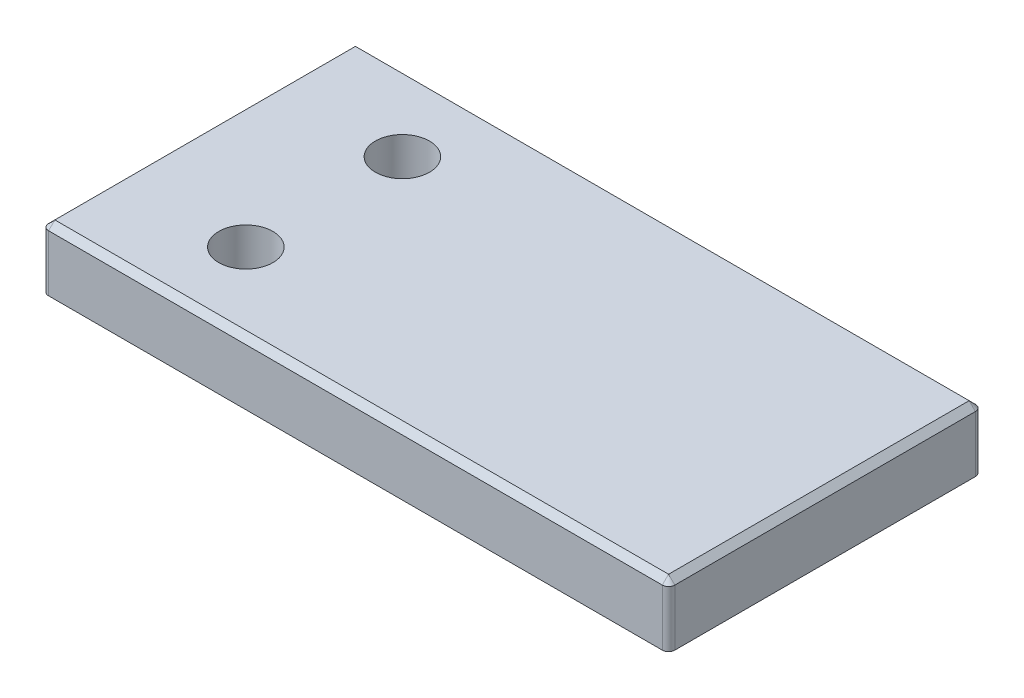
ISO-10303-21;
HEADER;
FILE_DESCRIPTION(('STEP AP214'),'2;1');
FILE_NAME('part.step','',(''),(''),'','','');
FILE_SCHEMA(('AUTOMOTIVE_DESIGN { 1 0 10303 214 1 1 1 1 }'));
ENDSEC;
DATA;
#1=APPLICATION_CONTEXT('core data for automotive mechanical design processes');
#2=APPLICATION_PROTOCOL_DEFINITION('international standard','automotive_design',2000,#1);
#3=PRODUCT_CONTEXT('',#1,'mechanical');
#4=PRODUCT('Part','Part','',(#3));
#5=PRODUCT_RELATED_PRODUCT_CATEGORY('part','',(#4));
#6=PRODUCT_DEFINITION_FORMATION('','',#4);
#7=PRODUCT_DEFINITION_CONTEXT('part definition',#1,'design');
#8=PRODUCT_DEFINITION('design','',#6,#7);
#9=PRODUCT_DEFINITION_SHAPE('','',#8);
#10=(LENGTH_UNIT() NAMED_UNIT(*) SI_UNIT(.MILLI.,.METRE.));
#11=(NAMED_UNIT(*) PLANE_ANGLE_UNIT() SI_UNIT($,.RADIAN.));
#12=(NAMED_UNIT(*) SI_UNIT($,.STERADIAN.) SOLID_ANGLE_UNIT());
#13=UNCERTAINTY_MEASURE_WITH_UNIT(LENGTH_MEASURE(1.E-05),#10,'distance_accuracy_value','');
#14=(GEOMETRIC_REPRESENTATION_CONTEXT(3) GLOBAL_UNCERTAINTY_ASSIGNED_CONTEXT((#13)) GLOBAL_UNIT_ASSIGNED_CONTEXT((#10,
#11,#12)) REPRESENTATION_CONTEXT('',''));
#15=CARTESIAN_POINT('',(0.,0.,0.));
#16=DIRECTION('',(0.,0.,1.));
#17=DIRECTION('',(1.,0.,0.));
#18=AXIS2_PLACEMENT_3D('',#15,#16,#17);
#19=CARTESIAN_POINT('',(-50.,10.,25.));
#20=DIRECTION('',(1.,0.,0.));
#21=DIRECTION('',(0.,0.,-1.));
#22=AXIS2_PLACEMENT_3D('',#19,#20,#21);
#23=PLANE('',#22);
#24=DIRECTION('',(0.,-1.,0.));
#25=VECTOR('',#24,1.);
#26=CARTESIAN_POINT('',(-50.,10.,24.));
#27=LINE('',#26,#25);
#28=CARTESIAN_POINT('',(-50.,0.,24.));
#29=VERTEX_POINT('',#28);
#30=CARTESIAN_POINT('',(-50.,9.00000000000001,24.));
#31=VERTEX_POINT('',#30);
#32=EDGE_CURVE('E125',#29,#31,#27,.F.);
#33=ORIENTED_EDGE('',*,*,#32,.T.);
#34=DIRECTION('',(0.,0.,-1.));
#35=VECTOR('',#34,1.);
#36=CARTESIAN_POINT('',(-50.,9.00000000000001,25.));
#37=LINE('',#36,#35);
#38=CARTESIAN_POINT('',(-50.,9.00000000000001,-24.));
#39=VERTEX_POINT('',#38);
#40=EDGE_CURVE('E42',#31,#39,#37,.T.);
#41=ORIENTED_EDGE('',*,*,#40,.T.);
#42=DIRECTION('',(0.,-1.,0.));
#43=VECTOR('',#42,1.);
#44=CARTESIAN_POINT('',(-50.,10.,-24.));
#45=LINE('',#44,#43);
#46=CARTESIAN_POINT('',(-50.,0.,-24.));
#47=VERTEX_POINT('',#46);
#48=EDGE_CURVE('E129',#39,#47,#45,.T.);
#49=ORIENTED_EDGE('',*,*,#48,.T.);
#50=DIRECTION('',(0.,0.,1.));
#51=VECTOR('',#50,1.);
#52=CARTESIAN_POINT('',(-50.,0.,25.));
#53=LINE('',#52,#51);
#54=EDGE_CURVE('E136',#47,#29,#53,.T.);
#55=ORIENTED_EDGE('',*,*,#54,.T.);
#56=EDGE_LOOP('',(#33,#41,#49,#55));
#57=FACE_BOUND('',#56,.T.);
#58=ADVANCED_FACE('F33',(#57),#23,.F.);
#59=CARTESIAN_POINT('',(50.,10.,25.));
#60=DIRECTION('',(0.,0.,-1.));
#61=DIRECTION('',(-1.,0.,0.));
#62=AXIS2_PLACEMENT_3D('',#59,#60,#61);
#63=PLANE('',#62);
#64=DIRECTION('',(0.,-1.,0.));
#65=VECTOR('',#64,1.);
#66=CARTESIAN_POINT('',(49.,10.,25.));
#67=LINE('',#66,#65);
#68=CARTESIAN_POINT('',(49.,0.,25.));
#69=VERTEX_POINT('',#68);
#70=CARTESIAN_POINT('',(49.,9.00000000000001,25.));
#71=VERTEX_POINT('',#70);
#72=EDGE_CURVE('E121',#69,#71,#67,.F.);
#73=ORIENTED_EDGE('',*,*,#72,.T.);
#74=DIRECTION('',(-1.,0.,0.));
#75=VECTOR('',#74,1.);
#76=CARTESIAN_POINT('',(50.,9.00000000000001,25.));
#77=LINE('',#76,#75);
#78=CARTESIAN_POINT('',(-49.,9.00000000000001,25.));
#79=VERTEX_POINT('',#78);
#80=EDGE_CURVE('E119',#71,#79,#77,.T.);
#81=ORIENTED_EDGE('',*,*,#80,.T.);
#82=DIRECTION('',(0.,-1.,0.));
#83=VECTOR('',#82,1.);
#84=CARTESIAN_POINT('',(-49.,10.,25.));
#85=LINE('',#84,#83);
#86=CARTESIAN_POINT('',(-49.,0.,25.));
#87=VERTEX_POINT('',#86);
#88=EDGE_CURVE('E111',#79,#87,#85,.T.);
#89=ORIENTED_EDGE('',*,*,#88,.T.);
#90=DIRECTION('',(1.,0.,0.));
#91=VECTOR('',#90,1.);
#92=CARTESIAN_POINT('',(50.,0.,25.));
#93=LINE('',#92,#91);
#94=EDGE_CURVE('E116',#87,#69,#93,.T.);
#95=ORIENTED_EDGE('',*,*,#94,.T.);
#96=EDGE_LOOP('',(#73,#81,#89,#95));
#97=FACE_BOUND('',#96,.T.);
#98=ADVANCED_FACE('F114',(#97),#63,.F.);
#99=CARTESIAN_POINT('',(50.,10.,-25.));
#100=DIRECTION('',(-1.,0.,0.));
#101=DIRECTION('',(0.,0.,1.));
#102=AXIS2_PLACEMENT_3D('',#99,#100,#101);
#103=PLANE('',#102);
#104=DIRECTION('',(0.,-1.,0.));
#105=VECTOR('',#104,1.);
#106=CARTESIAN_POINT('',(50.,10.,-24.));
#107=LINE('',#106,#105);
#108=CARTESIAN_POINT('',(50.,0.,-24.));
#109=VERTEX_POINT('',#108);
#110=CARTESIAN_POINT('',(50.,9.00000000000001,-24.));
#111=VERTEX_POINT('',#110);
#112=EDGE_CURVE('E161',#109,#111,#107,.F.);
#113=ORIENTED_EDGE('',*,*,#112,.T.);
#114=DIRECTION('',(0.,0.,1.));
#115=VECTOR('',#114,1.);
#116=CARTESIAN_POINT('',(50.,9.00000000000001,-25.));
#117=LINE('',#116,#115);
#118=CARTESIAN_POINT('',(50.,9.00000000000001,24.));
#119=VERTEX_POINT('',#118);
#120=EDGE_CURVE('E176',#111,#119,#117,.T.);
#121=ORIENTED_EDGE('',*,*,#120,.T.);
#122=DIRECTION('',(0.,-1.,0.));
#123=VECTOR('',#122,1.);
#124=CARTESIAN_POINT('',(50.,10.,24.));
#125=LINE('',#124,#123);
#126=CARTESIAN_POINT('',(50.,0.,24.));
#127=VERTEX_POINT('',#126);
#128=EDGE_CURVE('E159',#119,#127,#125,.T.);
#129=ORIENTED_EDGE('',*,*,#128,.T.);
#130=DIRECTION('',(0.,0.,-1.));
#131=VECTOR('',#130,1.);
#132=CARTESIAN_POINT('',(50.,0.,-25.));
#133=LINE('',#132,#131);
#134=EDGE_CURVE('E135',#127,#109,#133,.T.);
#135=ORIENTED_EDGE('',*,*,#134,.T.);
#136=EDGE_LOOP('',(#113,#121,#129,#135));
#137=FACE_BOUND('',#136,.T.);
#138=ADVANCED_FACE('F262',(#137),#103,.F.);
#139=CARTESIAN_POINT('',(-50.,10.,-25.));
#140=DIRECTION('',(0.,0.,1.));
#141=DIRECTION('',(1.,0.,0.));
#142=AXIS2_PLACEMENT_3D('',#139,#140,#141);
#143=PLANE('',#142);
#144=DIRECTION('',(0.,-1.,0.));
#145=VECTOR('',#144,1.);
#146=CARTESIAN_POINT('',(-49.,10.,-25.));
#147=LINE('',#146,#145);
#148=CARTESIAN_POINT('',(-49.,0.,-25.));
#149=VERTEX_POINT('',#148);
#150=CARTESIAN_POINT('',(-49.,9.00000000000001,-25.));
#151=VERTEX_POINT('',#150);
#152=EDGE_CURVE('E156',#149,#151,#147,.F.);
#153=ORIENTED_EDGE('',*,*,#152,.T.);
#154=DIRECTION('',(1.,0.,0.));
#155=VECTOR('',#154,1.);
#156=CARTESIAN_POINT('',(-50.,9.00000000000001,-25.));
#157=LINE('',#156,#155);
#158=CARTESIAN_POINT('',(49.,9.00000000000001,-25.));
#159=VERTEX_POINT('',#158);
#160=EDGE_CURVE('E180',#151,#159,#157,.T.);
#161=ORIENTED_EDGE('',*,*,#160,.T.);
#162=DIRECTION('',(0.,-1.,0.));
#163=VECTOR('',#162,1.);
#164=CARTESIAN_POINT('',(49.,10.,-25.));
#165=LINE('',#164,#163);
#166=CARTESIAN_POINT('',(49.,0.,-25.));
#167=VERTEX_POINT('',#166);
#168=EDGE_CURVE('E154',#159,#167,#165,.T.);
#169=ORIENTED_EDGE('',*,*,#168,.T.);
#170=DIRECTION('',(-1.,0.,0.));
#171=VECTOR('',#170,1.);
#172=CARTESIAN_POINT('',(-50.,0.,-25.));
#173=LINE('',#172,#171);
#174=EDGE_CURVE('E139',#167,#149,#173,.T.);
#175=ORIENTED_EDGE('',*,*,#174,.T.);
#176=EDGE_LOOP('',(#153,#161,#169,#175));
#177=FACE_BOUND('',#176,.T.);
#178=ADVANCED_FACE('F224',(#177),#143,.F.);
#179=CARTESIAN_POINT('',(0.,10.,0.));
#180=DIRECTION('',(0.,-1.,0.));
#181=DIRECTION('',(0.,0.,-1.));
#182=AXIS2_PLACEMENT_3D('',#179,#180,#181);
#183=PLANE('',#182);
#184=CARTESIAN_POINT('',(-30.,10.,-12.5));
#185=DIRECTION('',(0.,1.,0.));
#186=DIRECTION('',(0.,0.,1.));
#187=AXIS2_PLACEMENT_3D('',#184,#185,#186);
#188=CIRCLE('',#187,4.3235);
#189=CARTESIAN_POINT('',(-30.,10.,-8.1765));
#190=VERTEX_POINT('',#189);
#191=EDGE_CURVE('E214',#190,#190,#188,.T.);
#192=ORIENTED_EDGE('',*,*,#191,.F.);
#193=EDGE_LOOP('',(#192));
#194=FACE_BOUND('',#193,.T.);
#195=CARTESIAN_POINT('',(-30.,10.,12.5));
#196=DIRECTION('',(0.,1.,0.));
#197=DIRECTION('',(0.,0.,1.));
#198=AXIS2_PLACEMENT_3D('',#195,#196,#197);
#199=CIRCLE('',#198,4.3235);
#200=CARTESIAN_POINT('',(-30.,10.,16.8235));
#201=VERTEX_POINT('',#200);
#202=EDGE_CURVE('E207',#201,#201,#199,.T.);
#203=ORIENTED_EDGE('',*,*,#202,.F.);
#204=EDGE_LOOP('',(#203));
#205=FACE_BOUND('',#204,.T.);
#206=DIRECTION('',(0.,0.,1.));
#207=VECTOR('',#206,1.);
#208=CARTESIAN_POINT('',(-49.,10.,0.));
#209=LINE('',#208,#207);
#210=CARTESIAN_POINT('',(-49.,10.,-24.));
#211=VERTEX_POINT('',#210);
#212=CARTESIAN_POINT('',(-49.,10.,24.));
#213=VERTEX_POINT('',#212);
#214=EDGE_CURVE('E164',#211,#213,#209,.T.);
#215=ORIENTED_EDGE('',*,*,#214,.T.);
#216=DIRECTION('',(1.,0.,0.));
#217=VECTOR('',#216,1.);
#218=CARTESIAN_POINT('',(0.,10.,24.));
#219=LINE('',#218,#217);
#220=CARTESIAN_POINT('',(49.,10.,24.));
#221=VERTEX_POINT('',#220);
#222=EDGE_CURVE('E170',#213,#221,#219,.T.);
#223=ORIENTED_EDGE('',*,*,#222,.T.);
#224=DIRECTION('',(0.,0.,-1.));
#225=VECTOR('',#224,1.);
#226=CARTESIAN_POINT('',(49.,10.,0.));
#227=LINE('',#226,#225);
#228=CARTESIAN_POINT('',(49.,10.,-24.));
#229=VERTEX_POINT('',#228);
#230=EDGE_CURVE('E168',#221,#229,#227,.T.);
#231=ORIENTED_EDGE('',*,*,#230,.T.);
#232=DIRECTION('',(-1.,0.,0.));
#233=VECTOR('',#232,1.);
#234=CARTESIAN_POINT('',(0.,10.,-24.));
#235=LINE('',#234,#233);
#236=EDGE_CURVE('E166',#229,#211,#235,.T.);
#237=ORIENTED_EDGE('',*,*,#236,.T.);
#238=EDGE_LOOP('',(#215,#223,#231,#237));
#239=FACE_BOUND('',#238,.T.);
#240=ADVANCED_FACE('F221',(#194,#205,#239),#183,.F.);
#241=CARTESIAN_POINT('',(0.,0.,0.));
#242=DIRECTION('',(0.,-1.,0.));
#243=DIRECTION('',(0.,0.,-1.));
#244=AXIS2_PLACEMENT_3D('',#241,#242,#243);
#245=PLANE('',#244);
#246=CARTESIAN_POINT('',(-30.,0.,-12.5));
#247=DIRECTION('',(0.,-1.,0.));
#248=DIRECTION('',(0.,0.,-1.));
#249=AXIS2_PLACEMENT_3D('',#246,#247,#248);
#250=CIRCLE('',#249,4.3235);
#251=CARTESIAN_POINT('',(-30.,0.,-16.8235));
#252=VERTEX_POINT('',#251);
#253=EDGE_CURVE('E37',#252,#252,#250,.T.);
#254=ORIENTED_EDGE('',*,*,#253,.F.);
#255=EDGE_LOOP('',(#254));
#256=FACE_BOUND('',#255,.T.);
#257=CARTESIAN_POINT('',(-30.,0.,12.5));
#258=DIRECTION('',(0.,-1.,0.));
#259=DIRECTION('',(0.,0.,-1.));
#260=AXIS2_PLACEMENT_3D('',#257,#258,#259);
#261=CIRCLE('',#260,4.3235);
#262=CARTESIAN_POINT('',(-30.,0.,8.1765));
#263=VERTEX_POINT('',#262);
#264=EDGE_CURVE('E188',#263,#263,#261,.T.);
#265=ORIENTED_EDGE('',*,*,#264,.F.);
#266=EDGE_LOOP('',(#265));
#267=FACE_BOUND('',#266,.T.);
#268=ORIENTED_EDGE('',*,*,#94,.F.);
#269=CARTESIAN_POINT('',(-49.,0.,24.));
#270=DIRECTION('',(0.,-1.,0.));
#271=DIRECTION('',(0.,0.,-1.));
#272=AXIS2_PLACEMENT_3D('',#269,#270,#271);
#273=CIRCLE('',#272,1.);
#274=EDGE_CURVE('E123',#87,#29,#273,.T.);
#275=ORIENTED_EDGE('',*,*,#274,.T.);
#276=ORIENTED_EDGE('',*,*,#54,.F.);
#277=CARTESIAN_POINT('',(-49.,0.,-24.));
#278=DIRECTION('',(0.,-1.,0.));
#279=DIRECTION('',(0.,0.,-1.));
#280=AXIS2_PLACEMENT_3D('',#277,#278,#279);
#281=CIRCLE('',#280,1.);
#282=EDGE_CURVE('E130',#47,#149,#281,.T.);
#283=ORIENTED_EDGE('',*,*,#282,.T.);
#284=ORIENTED_EDGE('',*,*,#174,.F.);
#285=CARTESIAN_POINT('',(49.,0.,-24.));
#286=DIRECTION('',(0.,-1.,0.));
#287=DIRECTION('',(0.,0.,-1.));
#288=AXIS2_PLACEMENT_3D('',#285,#286,#287);
#289=CIRCLE('',#288,1.);
#290=EDGE_CURVE('E149',#167,#109,#289,.T.);
#291=ORIENTED_EDGE('',*,*,#290,.T.);
#292=ORIENTED_EDGE('',*,*,#134,.F.);
#293=CARTESIAN_POINT('',(49.,0.,24.));
#294=DIRECTION('',(0.,-1.,0.));
#295=DIRECTION('',(0.,0.,-1.));
#296=AXIS2_PLACEMENT_3D('',#293,#294,#295);
#297=CIRCLE('',#296,1.);
#298=EDGE_CURVE('E120',#127,#69,#297,.T.);
#299=ORIENTED_EDGE('',*,*,#298,.T.);
#300=EDGE_LOOP('',(#268,#275,#276,#283,#284,#291,#292,#299));
#301=FACE_BOUND('',#300,.T.);
#302=ADVANCED_FACE('F132',(#256,#267,#301),#245,.T.);
#303=CARTESIAN_POINT('',(-49.,10.,24.));
#304=DIRECTION('',(0.,-1.,0.));
#305=DIRECTION('',(0.,0.,-1.));
#306=AXIS2_PLACEMENT_3D('',#303,#304,#305);
#307=CYLINDRICAL_SURFACE('',#306,1.);
#308=ORIENTED_EDGE('',*,*,#88,.F.);
#309=CARTESIAN_POINT('',(-49.,9.00000000000001,24.));
#310=DIRECTION('',(0.,-1.,0.));
#311=DIRECTION('',(0.,0.,-1.));
#312=AXIS2_PLACEMENT_3D('',#309,#310,#311);
#313=CIRCLE('',#312,1.);
#314=EDGE_CURVE('E11',#79,#31,#313,.T.);
#315=ORIENTED_EDGE('',*,*,#314,.T.);
#316=ORIENTED_EDGE('',*,*,#32,.F.);
#317=ORIENTED_EDGE('',*,*,#274,.F.);
#318=EDGE_LOOP('',(#308,#315,#316,#317));
#319=FACE_BOUND('',#318,.T.);
#320=ADVANCED_FACE('F124',(#319),#307,.T.);
#321=CARTESIAN_POINT('',(-49.,10.,-24.));
#322=DIRECTION('',(0.,-1.,0.));
#323=DIRECTION('',(0.,0.,-1.));
#324=AXIS2_PLACEMENT_3D('',#321,#322,#323);
#325=CYLINDRICAL_SURFACE('',#324,1.);
#326=ORIENTED_EDGE('',*,*,#48,.F.);
#327=CARTESIAN_POINT('',(-49.,9.00000000000001,-24.));
#328=DIRECTION('',(0.,-1.,0.));
#329=DIRECTION('',(0.,0.,-1.));
#330=AXIS2_PLACEMENT_3D('',#327,#328,#329);
#331=CIRCLE('',#330,1.);
#332=EDGE_CURVE('E182',#39,#151,#331,.T.);
#333=ORIENTED_EDGE('',*,*,#332,.T.);
#334=ORIENTED_EDGE('',*,*,#152,.F.);
#335=ORIENTED_EDGE('',*,*,#282,.F.);
#336=EDGE_LOOP('',(#326,#333,#334,#335));
#337=FACE_BOUND('',#336,.T.);
#338=ADVANCED_FACE('F269',(#337),#325,.T.);
#339=CARTESIAN_POINT('',(49.,10.,-24.));
#340=DIRECTION('',(0.,-1.,0.));
#341=DIRECTION('',(0.,0.,-1.));
#342=AXIS2_PLACEMENT_3D('',#339,#340,#341);
#343=CYLINDRICAL_SURFACE('',#342,1.);
#344=ORIENTED_EDGE('',*,*,#168,.F.);
#345=CARTESIAN_POINT('',(49.,9.00000000000001,-24.));
#346=DIRECTION('',(0.,-1.,0.));
#347=DIRECTION('',(0.,0.,-1.));
#348=AXIS2_PLACEMENT_3D('',#345,#346,#347);
#349=CIRCLE('',#348,1.);
#350=EDGE_CURVE('E178',#159,#111,#349,.T.);
#351=ORIENTED_EDGE('',*,*,#350,.T.);
#352=ORIENTED_EDGE('',*,*,#112,.F.);
#353=ORIENTED_EDGE('',*,*,#290,.F.);
#354=EDGE_LOOP('',(#344,#351,#352,#353));
#355=FACE_BOUND('',#354,.T.);
#356=ADVANCED_FACE('F259',(#355),#343,.T.);
#357=CARTESIAN_POINT('',(49.,10.,24.));
#358=DIRECTION('',(0.,-1.,0.));
#359=DIRECTION('',(0.,0.,-1.));
#360=AXIS2_PLACEMENT_3D('',#357,#358,#359);
#361=CYLINDRICAL_SURFACE('',#360,1.);
#362=ORIENTED_EDGE('',*,*,#128,.F.);
#363=CARTESIAN_POINT('',(49.,9.00000000000001,24.));
#364=DIRECTION('',(0.,-1.,0.));
#365=DIRECTION('',(0.,0.,-1.));
#366=AXIS2_PLACEMENT_3D('',#363,#364,#365);
#367=CIRCLE('',#366,1.);
#368=EDGE_CURVE('E174',#119,#71,#367,.T.);
#369=ORIENTED_EDGE('',*,*,#368,.T.);
#370=ORIENTED_EDGE('',*,*,#72,.F.);
#371=ORIENTED_EDGE('',*,*,#298,.F.);
#372=EDGE_LOOP('',(#362,#369,#370,#371));
#373=FACE_BOUND('',#372,.T.);
#374=ADVANCED_FACE('F279',(#373),#361,.T.);
#375=CARTESIAN_POINT('',(0.,10.,-24.));
#376=DIRECTION('',(0.,-0.707106781186547,0.707106781186547));
#377=DIRECTION('',(-1.,0.,0.));
#378=AXIS2_PLACEMENT_3D('',#375,#376,#377);
#379=PLANE('',#378);
#380=DIRECTION('',(0.,0.707106781186547,0.707106781186547));
#381=VECTOR('',#380,1.);
#382=CARTESIAN_POINT('',(49.,9.00000000000001,-25.));
#383=LINE('',#382,#381);
#384=EDGE_CURVE('E202',#159,#229,#383,.T.);
#385=ORIENTED_EDGE('',*,*,#384,.F.);
#386=ORIENTED_EDGE('',*,*,#160,.F.);
#387=DIRECTION('',(0.,-0.707106781186547,-0.707106781186547));
#388=VECTOR('',#387,1.);
#389=CARTESIAN_POINT('',(-49.,10.,-24.));
#390=LINE('',#389,#388);
#391=EDGE_CURVE('E141',#211,#151,#390,.T.);
#392=ORIENTED_EDGE('',*,*,#391,.F.);
#393=ORIENTED_EDGE('',*,*,#236,.F.);
#394=EDGE_LOOP('',(#385,#386,#392,#393));
#395=FACE_BOUND('',#394,.T.);
#396=ADVANCED_FACE('F35',(#395),#379,.F.);
#397=CARTESIAN_POINT('',(-49.,9.00000000000001,-24.));
#398=DIRECTION('',(0.,-1.,0.));
#399=DIRECTION('',(0.,0.,-1.));
#400=AXIS2_PLACEMENT_3D('',#397,#398,#399);
#401=CONICAL_SURFACE('',#400,0.999999999999987,0.785398163397448);
#402=ORIENTED_EDGE('',*,*,#391,.T.);
#403=ORIENTED_EDGE('',*,*,#332,.F.);
#404=DIRECTION('',(-0.707106781186547,-0.707106781186547,0.));
#405=VECTOR('',#404,1.);
#406=CARTESIAN_POINT('',(-49.,10.,-24.));
#407=LINE('',#406,#405);
#408=EDGE_CURVE('E199',#211,#39,#407,.T.);
#409=ORIENTED_EDGE('',*,*,#408,.F.);
#410=EDGE_LOOP('',(#402,#403,#409));
#411=FACE_BOUND('',#410,.T.);
#412=ADVANCED_FACE('F272',(#411),#401,.T.);
#413=CARTESIAN_POINT('',(49.,9.00000000000001,-24.));
#414=DIRECTION('',(0.,-1.,0.));
#415=DIRECTION('',(0.,0.,-1.));
#416=AXIS2_PLACEMENT_3D('',#413,#414,#415);
#417=CONICAL_SURFACE('',#416,0.999999999999987,0.785398163397448);
#418=ORIENTED_EDGE('',*,*,#350,.F.);
#419=ORIENTED_EDGE('',*,*,#384,.T.);
#420=DIRECTION('',(-0.707106781186547,0.707106781186547,0.));
#421=VECTOR('',#420,1.);
#422=CARTESIAN_POINT('',(50.,9.00000000000001,-24.));
#423=LINE('',#422,#421);
#424=EDGE_CURVE('E196',#111,#229,#423,.T.);
#425=ORIENTED_EDGE('',*,*,#424,.F.);
#426=EDGE_LOOP('',(#418,#419,#425));
#427=FACE_BOUND('',#426,.T.);
#428=ADVANCED_FACE('F255',(#427),#417,.T.);
#429=CARTESIAN_POINT('',(-49.,10.,0.));
#430=DIRECTION('',(0.707106781186547,-0.707106781186547,0.));
#431=DIRECTION('',(0.,0.,1.));
#432=AXIS2_PLACEMENT_3D('',#429,#430,#431);
#433=PLANE('',#432);
#434=ORIENTED_EDGE('',*,*,#408,.T.);
#435=ORIENTED_EDGE('',*,*,#40,.F.);
#436=DIRECTION('',(-0.707106781186547,-0.707106781186547,0.));
#437=VECTOR('',#436,1.);
#438=CARTESIAN_POINT('',(-49.,10.,24.));
#439=LINE('',#438,#437);
#440=EDGE_CURVE('E193',#213,#31,#439,.T.);
#441=ORIENTED_EDGE('',*,*,#440,.F.);
#442=ORIENTED_EDGE('',*,*,#214,.F.);
#443=EDGE_LOOP('',(#434,#435,#441,#442));
#444=FACE_BOUND('',#443,.T.);
#445=ADVANCED_FACE('F234',(#444),#433,.F.);
#446=CARTESIAN_POINT('',(49.,10.,0.));
#447=DIRECTION('',(-0.707106781186547,-0.707106781186547,0.));
#448=DIRECTION('',(0.,0.,-1.));
#449=AXIS2_PLACEMENT_3D('',#446,#447,#448);
#450=PLANE('',#449);
#451=ORIENTED_EDGE('',*,*,#424,.T.);
#452=ORIENTED_EDGE('',*,*,#230,.F.);
#453=DIRECTION('',(-0.707106781186547,0.707106781186547,0.));
#454=VECTOR('',#453,1.);
#455=CARTESIAN_POINT('',(50.,9.00000000000001,24.));
#456=LINE('',#455,#454);
#457=EDGE_CURVE('E190',#119,#221,#456,.T.);
#458=ORIENTED_EDGE('',*,*,#457,.F.);
#459=ORIENTED_EDGE('',*,*,#120,.F.);
#460=EDGE_LOOP('',(#451,#452,#458,#459));
#461=FACE_BOUND('',#460,.T.);
#462=ADVANCED_FACE('F247',(#461),#450,.F.);
#463=CARTESIAN_POINT('',(-49.,9.00000000000001,24.));
#464=DIRECTION('',(0.,-1.,0.));
#465=DIRECTION('',(0.,0.,-1.));
#466=AXIS2_PLACEMENT_3D('',#463,#464,#465);
#467=CONICAL_SURFACE('',#466,0.999999999999987,0.785398163397448);
#468=ORIENTED_EDGE('',*,*,#440,.T.);
#469=ORIENTED_EDGE('',*,*,#314,.F.);
#470=DIRECTION('',(0.,-0.707106781186547,0.707106781186547));
#471=VECTOR('',#470,1.);
#472=CARTESIAN_POINT('',(-49.,10.,24.));
#473=LINE('',#472,#471);
#474=EDGE_CURVE('E187',#213,#79,#473,.T.);
#475=ORIENTED_EDGE('',*,*,#474,.F.);
#476=EDGE_LOOP('',(#468,#469,#475));
#477=FACE_BOUND('',#476,.T.);
#478=ADVANCED_FACE('F236',(#477),#467,.T.);
#479=CARTESIAN_POINT('',(49.,9.00000000000001,24.));
#480=DIRECTION('',(0.,-1.,0.));
#481=DIRECTION('',(0.,0.,-1.));
#482=AXIS2_PLACEMENT_3D('',#479,#480,#481);
#483=CONICAL_SURFACE('',#482,0.999999999999987,0.785398163397448);
#484=ORIENTED_EDGE('',*,*,#368,.F.);
#485=ORIENTED_EDGE('',*,*,#457,.T.);
#486=DIRECTION('',(0.,0.707106781186547,-0.707106781186547));
#487=VECTOR('',#486,1.);
#488=CARTESIAN_POINT('',(49.,9.00000000000001,25.));
#489=LINE('',#488,#487);
#490=EDGE_CURVE('E185',#71,#221,#489,.T.);
#491=ORIENTED_EDGE('',*,*,#490,.F.);
#492=EDGE_LOOP('',(#484,#485,#491));
#493=FACE_BOUND('',#492,.T.);
#494=ADVANCED_FACE('F244',(#493),#483,.T.);
#495=CARTESIAN_POINT('',(0.,10.,24.));
#496=DIRECTION('',(0.,-0.707106781186547,-0.707106781186547));
#497=DIRECTION('',(1.,0.,0.));
#498=AXIS2_PLACEMENT_3D('',#495,#496,#497);
#499=PLANE('',#498);
#500=ORIENTED_EDGE('',*,*,#474,.T.);
#501=ORIENTED_EDGE('',*,*,#80,.F.);
#502=ORIENTED_EDGE('',*,*,#490,.T.);
#503=ORIENTED_EDGE('',*,*,#222,.F.);
#504=EDGE_LOOP('',(#500,#501,#502,#503));
#505=FACE_BOUND('',#504,.T.);
#506=ADVANCED_FACE('F238',(#505),#499,.F.);
#507=CARTESIAN_POINT('',(-30.,10.,12.5));
#508=DIRECTION('',(0.,1.,0.));
#509=DIRECTION('',(0.,0.,1.));
#510=AXIS2_PLACEMENT_3D('',#507,#508,#509);
#511=CYLINDRICAL_SURFACE('',#510,4.3235);
#512=ORIENTED_EDGE('',*,*,#264,.T.);
#513=EDGE_LOOP('',(#512));
#514=FACE_BOUND('',#513,.T.);
#515=ORIENTED_EDGE('',*,*,#202,.T.);
#516=EDGE_LOOP('',(#515));
#517=FACE_BOUND('',#516,.T.);
#518=ADVANCED_FACE('F299',(#514,#517),#511,.F.);
#519=CARTESIAN_POINT('',(-30.,10.,-12.5));
#520=DIRECTION('',(0.,1.,0.));
#521=DIRECTION('',(0.,0.,1.));
#522=AXIS2_PLACEMENT_3D('',#519,#520,#521);
#523=CYLINDRICAL_SURFACE('',#522,4.3235);
#524=ORIENTED_EDGE('',*,*,#253,.T.);
#525=EDGE_LOOP('',(#524));
#526=FACE_BOUND('',#525,.T.);
#527=ORIENTED_EDGE('',*,*,#191,.T.);
#528=EDGE_LOOP('',(#527));
#529=FACE_BOUND('',#528,.T.);
#530=ADVANCED_FACE('F219',(#526,#529),#523,.F.);
#531=CLOSED_SHELL('',(#58,#98,#138,#178,#240,#302,#320,#338,#356,#374,#396,#412,#428,#445,#462,
#478,#494,#506,#518,#530));
#532=MANIFOLD_SOLID_BREP('B2',#531);
#533=ADVANCED_BREP_SHAPE_REPRESENTATION('',(#18,#532),#14);
#534=SHAPE_DEFINITION_REPRESENTATION(#9,#533);
ENDSEC;
END-ISO-10303-21;
